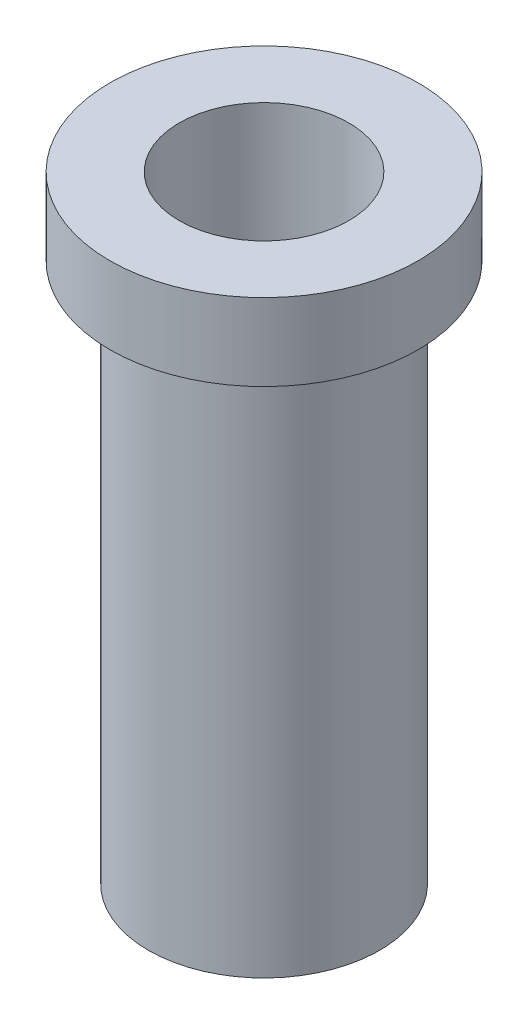
ISO-10303-21;
HEADER;
FILE_DESCRIPTION(('STEP AP214'),'2;1');
FILE_NAME('part.step','',(''),(''),'','','');
FILE_SCHEMA(('AUTOMOTIVE_DESIGN { 1 0 10303 214 1 1 1 1 }'));
ENDSEC;
DATA;
#1=APPLICATION_CONTEXT('core data for automotive mechanical design processes');
#2=APPLICATION_PROTOCOL_DEFINITION('international standard','automotive_design',2000,#1);
#3=PRODUCT_CONTEXT('',#1,'mechanical');
#4=PRODUCT('Part','Part','',(#3));
#5=PRODUCT_RELATED_PRODUCT_CATEGORY('part','',(#4));
#6=PRODUCT_DEFINITION_FORMATION('','',#4);
#7=PRODUCT_DEFINITION_CONTEXT('part definition',#1,'design');
#8=PRODUCT_DEFINITION('design','',#6,#7);
#9=PRODUCT_DEFINITION_SHAPE('','',#8);
#10=(LENGTH_UNIT() NAMED_UNIT(*) SI_UNIT(.MILLI.,.METRE.));
#11=(NAMED_UNIT(*) PLANE_ANGLE_UNIT() SI_UNIT($,.RADIAN.));
#12=(NAMED_UNIT(*) SI_UNIT($,.STERADIAN.) SOLID_ANGLE_UNIT());
#13=UNCERTAINTY_MEASURE_WITH_UNIT(LENGTH_MEASURE(1.E-05),#10,'distance_accuracy_value','');
#14=(GEOMETRIC_REPRESENTATION_CONTEXT(3) GLOBAL_UNCERTAINTY_ASSIGNED_CONTEXT((#13)) GLOBAL_UNIT_ASSIGNED_CONTEXT((#10,
#11,#12)) REPRESENTATION_CONTEXT('',''));
#15=CARTESIAN_POINT('',(0.,0.,0.));
#16=DIRECTION('',(0.,0.,1.));
#17=DIRECTION('',(1.,0.,0.));
#18=AXIS2_PLACEMENT_3D('',#15,#16,#17);
#19=CARTESIAN_POINT('',(0.,-40.,0.));
#20=DIRECTION('',(0.,1.,0.));
#21=DIRECTION('',(0.,0.,1.));
#22=AXIS2_PLACEMENT_3D('',#19,#20,#21);
#23=CYLINDRICAL_SURFACE('',#22,7.5);
#24=CARTESIAN_POINT('',(0.,-40.,0.));
#25=DIRECTION('',(0.,1.,0.));
#26=DIRECTION('',(0.,0.,1.));
#27=AXIS2_PLACEMENT_3D('',#24,#25,#26);
#28=CIRCLE('',#27,7.5);
#29=CARTESIAN_POINT('',(0.,-40.,7.5));
#30=VERTEX_POINT('',#29);
#31=EDGE_CURVE('E10',#30,#30,#28,.T.);
#32=ORIENTED_EDGE('',*,*,#31,.T.);
#33=EDGE_LOOP('',(#32));
#34=FACE_BOUND('',#33,.T.);
#35=CARTESIAN_POINT('',(0.,-5.,0.));
#36=DIRECTION('',(0.,1.,0.));
#37=DIRECTION('',(0.,0.,1.));
#38=AXIS2_PLACEMENT_3D('',#35,#36,#37);
#39=CIRCLE('',#38,7.5);
#40=CARTESIAN_POINT('',(0.,-5.,7.5));
#41=VERTEX_POINT('',#40);
#42=EDGE_CURVE('E42',#41,#41,#39,.F.);
#43=ORIENTED_EDGE('',*,*,#42,.T.);
#44=EDGE_LOOP('',(#43));
#45=FACE_BOUND('',#44,.T.);
#46=ADVANCED_FACE('F39',(#34,#45),#23,.T.);
#47=CARTESIAN_POINT('',(0.,-40.,0.));
#48=DIRECTION('',(0.,1.,0.));
#49=DIRECTION('',(0.,0.,1.));
#50=AXIS2_PLACEMENT_3D('',#47,#48,#49);
#51=PLANE('',#50);
#52=CARTESIAN_POINT('',(0.,-40.,0.));
#53=DIRECTION('',(0.,1.,0.));
#54=DIRECTION('',(0.,0.,1.));
#55=AXIS2_PLACEMENT_3D('',#52,#53,#54);
#56=CIRCLE('',#55,5.5);
#57=CARTESIAN_POINT('',(0.,-40.,5.5));
#58=VERTEX_POINT('',#57);
#59=EDGE_CURVE('E54',#58,#58,#56,.T.);
#60=ORIENTED_EDGE('',*,*,#59,.T.);
#61=EDGE_LOOP('',(#60));
#62=FACE_BOUND('',#61,.T.);
#63=ORIENTED_EDGE('',*,*,#31,.F.);
#64=EDGE_LOOP('',(#63));
#65=FACE_BOUND('',#64,.T.);
#66=ADVANCED_FACE('F63',(#62,#65),#51,.F.);
#67=CARTESIAN_POINT('',(0.,-5.,0.));
#68=DIRECTION('',(0.,1.,0.));
#69=DIRECTION('',(0.,0.,1.));
#70=AXIS2_PLACEMENT_3D('',#67,#68,#69);
#71=CYLINDRICAL_SURFACE('',#70,10.);
#72=CARTESIAN_POINT('',(0.,-5.,0.));
#73=DIRECTION('',(0.,1.,0.));
#74=DIRECTION('',(0.,0.,1.));
#75=AXIS2_PLACEMENT_3D('',#72,#73,#74);
#76=CIRCLE('',#75,10.);
#77=CARTESIAN_POINT('',(0.,-5.,10.));
#78=VERTEX_POINT('',#77);
#79=EDGE_CURVE('E49',#78,#78,#76,.T.);
#80=ORIENTED_EDGE('',*,*,#79,.T.);
#81=EDGE_LOOP('',(#80));
#82=FACE_BOUND('',#81,.T.);
#83=CARTESIAN_POINT('',(0.,0.,0.));
#84=DIRECTION('',(0.,1.,0.));
#85=DIRECTION('',(0.,0.,1.));
#86=AXIS2_PLACEMENT_3D('',#83,#84,#85);
#87=CIRCLE('',#86,10.);
#88=CARTESIAN_POINT('',(0.,0.,10.));
#89=VERTEX_POINT('',#88);
#90=EDGE_CURVE('E51',#89,#89,#87,.T.);
#91=ORIENTED_EDGE('',*,*,#90,.F.);
#92=EDGE_LOOP('',(#91));
#93=FACE_BOUND('',#92,.T.);
#94=ADVANCED_FACE('F78',(#82,#93),#71,.T.);
#95=CARTESIAN_POINT('',(0.,-5.,0.));
#96=DIRECTION('',(0.,1.,0.));
#97=DIRECTION('',(0.,0.,1.));
#98=AXIS2_PLACEMENT_3D('',#95,#96,#97);
#99=PLANE('',#98);
#100=ORIENTED_EDGE('',*,*,#42,.F.);
#101=EDGE_LOOP('',(#100));
#102=FACE_BOUND('',#101,.T.);
#103=ORIENTED_EDGE('',*,*,#79,.F.);
#104=EDGE_LOOP('',(#103));
#105=FACE_BOUND('',#104,.T.);
#106=ADVANCED_FACE('F75',(#102,#105),#99,.F.);
#107=CARTESIAN_POINT('',(0.,0.,0.));
#108=DIRECTION('',(0.,1.,0.));
#109=DIRECTION('',(0.,0.,1.));
#110=AXIS2_PLACEMENT_3D('',#107,#108,#109);
#111=PLANE('',#110);
#112=CARTESIAN_POINT('',(0.,0.,0.));
#113=DIRECTION('',(0.,1.,0.));
#114=DIRECTION('',(0.,0.,1.));
#115=AXIS2_PLACEMENT_3D('',#112,#113,#114);
#116=CIRCLE('',#115,5.5);
#117=CARTESIAN_POINT('',(0.,0.,5.5));
#118=VERTEX_POINT('',#117);
#119=EDGE_CURVE('E57',#118,#118,#116,.T.);
#120=ORIENTED_EDGE('',*,*,#119,.F.);
#121=EDGE_LOOP('',(#120));
#122=FACE_BOUND('',#121,.T.);
#123=ORIENTED_EDGE('',*,*,#90,.T.);
#124=EDGE_LOOP('',(#123));
#125=FACE_BOUND('',#124,.T.);
#126=ADVANCED_FACE('F69',(#122,#125),#111,.T.);
#127=CARTESIAN_POINT('',(0.,-40.,0.));
#128=DIRECTION('',(0.,1.,0.));
#129=DIRECTION('',(0.,0.,1.));
#130=AXIS2_PLACEMENT_3D('',#127,#128,#129);
#131=CYLINDRICAL_SURFACE('',#130,5.5);
#132=ORIENTED_EDGE('',*,*,#59,.F.);
#133=EDGE_LOOP('',(#132));
#134=FACE_BOUND('',#133,.T.);
#135=ORIENTED_EDGE('',*,*,#119,.T.);
#136=EDGE_LOOP('',(#135));
#137=FACE_BOUND('',#136,.T.);
#138=ADVANCED_FACE('F66',(#134,#137),#131,.F.);
#139=CLOSED_SHELL('',(#46,#66,#94,#106,#126,#138));
#140=MANIFOLD_SOLID_BREP('B2',#139);
#141=ADVANCED_BREP_SHAPE_REPRESENTATION('',(#18,#140),#14);
#142=SHAPE_DEFINITION_REPRESENTATION(#9,#141);
ENDSEC;
END-ISO-10303-21;
